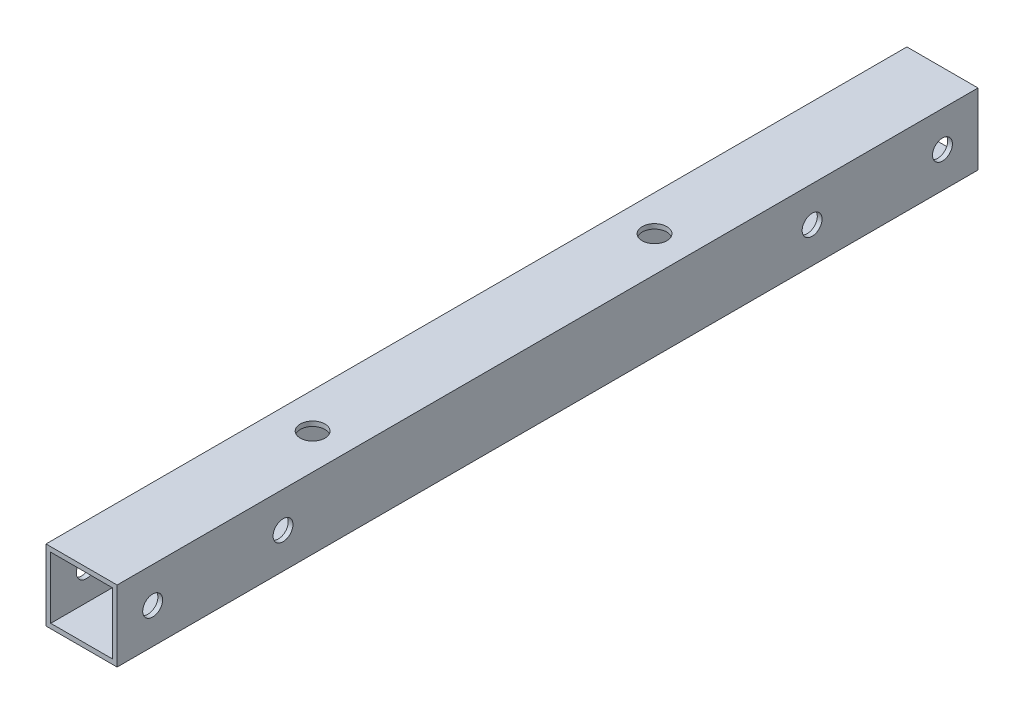
ISO-10303-21;
HEADER;
FILE_DESCRIPTION(('STEP AP214'),'2;1');
FILE_NAME('part.step','',(''),(''),'','','');
FILE_SCHEMA(('AUTOMOTIVE_DESIGN { 1 0 10303 214 1 1 1 1 }'));
ENDSEC;
DATA;
#1=APPLICATION_CONTEXT('core data for automotive mechanical design processes');
#2=APPLICATION_PROTOCOL_DEFINITION('international standard','automotive_design',2000,#1);
#3=PRODUCT_CONTEXT('',#1,'mechanical');
#4=PRODUCT('Part','Part','',(#3));
#5=PRODUCT_RELATED_PRODUCT_CATEGORY('part','',(#4));
#6=PRODUCT_DEFINITION_FORMATION('','',#4);
#7=PRODUCT_DEFINITION_CONTEXT('part definition',#1,'design');
#8=PRODUCT_DEFINITION('design','',#6,#7);
#9=PRODUCT_DEFINITION_SHAPE('','',#8);
#10=(LENGTH_UNIT() NAMED_UNIT(*) SI_UNIT(.MILLI.,.METRE.));
#11=(NAMED_UNIT(*) PLANE_ANGLE_UNIT() SI_UNIT($,.RADIAN.));
#12=(NAMED_UNIT(*) SI_UNIT($,.STERADIAN.) SOLID_ANGLE_UNIT());
#13=UNCERTAINTY_MEASURE_WITH_UNIT(LENGTH_MEASURE(1.E-05),#10,'distance_accuracy_value','');
#14=(GEOMETRIC_REPRESENTATION_CONTEXT(3) GLOBAL_UNCERTAINTY_ASSIGNED_CONTEXT((#13)) GLOBAL_UNIT_ASSIGNED_CONTEXT((#10,
#11,#12)) REPRESENTATION_CONTEXT('',''));
#15=CARTESIAN_POINT('',(0.,0.,0.));
#16=DIRECTION('',(0.,0.,1.));
#17=DIRECTION('',(1.,0.,0.));
#18=AXIS2_PLACEMENT_3D('',#15,#16,#17);
#19=CARTESIAN_POINT('',(0.,0.,181.6));
#20=DIRECTION('',(0.,0.,1.));
#21=DIRECTION('',(1.,0.,0.));
#22=AXIS2_PLACEMENT_3D('',#19,#20,#21);
#23=PLANE('',#22);
#24=DIRECTION('',(0.,-1.,0.));
#25=VECTOR('',#24,1.);
#26=CARTESIAN_POINT('',(-7.5,7.5,181.6));
#27=LINE('',#26,#25);
#28=CARTESIAN_POINT('',(-7.5,7.5,181.6));
#29=VERTEX_POINT('',#28);
#30=CARTESIAN_POINT('',(-7.5,-7.5,181.6));
#31=VERTEX_POINT('',#30);
#32=EDGE_CURVE('E162',#29,#31,#27,.T.);
#33=ORIENTED_EDGE('',*,*,#32,.T.);
#34=DIRECTION('',(1.,0.,0.));
#35=VECTOR('',#34,1.);
#36=CARTESIAN_POINT('',(7.5,-7.5,181.6));
#37=LINE('',#36,#35);
#38=CARTESIAN_POINT('',(7.5,-7.5,181.6));
#39=VERTEX_POINT('',#38);
#40=EDGE_CURVE('E165',#31,#39,#37,.T.);
#41=ORIENTED_EDGE('',*,*,#40,.T.);
#42=DIRECTION('',(0.,1.,0.));
#43=VECTOR('',#42,1.);
#44=CARTESIAN_POINT('',(7.5,7.5,181.6));
#45=LINE('',#44,#43);
#46=CARTESIAN_POINT('',(7.5,7.5,181.6));
#47=VERTEX_POINT('',#46);
#48=EDGE_CURVE('E168',#39,#47,#45,.T.);
#49=ORIENTED_EDGE('',*,*,#48,.T.);
#50=DIRECTION('',(-1.,0.,0.));
#51=VECTOR('',#50,1.);
#52=CARTESIAN_POINT('',(7.5,7.5,181.6));
#53=LINE('',#52,#51);
#54=EDGE_CURVE('E170',#47,#29,#53,.T.);
#55=ORIENTED_EDGE('',*,*,#54,.T.);
#56=EDGE_LOOP('',(#33,#41,#49,#55));
#57=FACE_BOUND('',#56,.T.);
#58=DIRECTION('',(1.,0.,0.));
#59=VECTOR('',#58,1.);
#60=CARTESIAN_POINT('',(0.,-6.5,181.6));
#61=LINE('',#60,#59);
#62=CARTESIAN_POINT('',(-6.5,-6.5,181.6));
#63=VERTEX_POINT('',#62);
#64=CARTESIAN_POINT('',(6.5,-6.5,181.6));
#65=VERTEX_POINT('',#64);
#66=EDGE_CURVE('E132',#63,#65,#61,.T.);
#67=ORIENTED_EDGE('',*,*,#66,.F.);
#68=DIRECTION('',(0.,-1.,0.));
#69=VECTOR('',#68,1.);
#70=CARTESIAN_POINT('',(-6.5,0.,181.6));
#71=LINE('',#70,#69);
#72=CARTESIAN_POINT('',(-6.5,6.5,181.6));
#73=VERTEX_POINT('',#72);
#74=EDGE_CURVE('E124',#73,#63,#71,.T.);
#75=ORIENTED_EDGE('',*,*,#74,.F.);
#76=DIRECTION('',(-1.,0.,0.));
#77=VECTOR('',#76,1.);
#78=CARTESIAN_POINT('',(0.,6.5,181.6));
#79=LINE('',#78,#77);
#80=CARTESIAN_POINT('',(6.5,6.5,181.6));
#81=VERTEX_POINT('',#80);
#82=EDGE_CURVE('E146',#81,#73,#79,.T.);
#83=ORIENTED_EDGE('',*,*,#82,.F.);
#84=DIRECTION('',(0.,1.,0.));
#85=VECTOR('',#84,1.);
#86=CARTESIAN_POINT('',(6.5,0.,181.6));
#87=LINE('',#86,#85);
#88=EDGE_CURVE('E144',#65,#81,#87,.T.);
#89=ORIENTED_EDGE('',*,*,#88,.F.);
#90=EDGE_LOOP('',(#67,#75,#83,#89));
#91=FACE_BOUND('',#90,.T.);
#92=ADVANCED_FACE('F57',(#57,#91),#23,.T.);
#93=CARTESIAN_POINT('',(0.,0.,0.));
#94=DIRECTION('',(0.,0.,1.));
#95=DIRECTION('',(1.,0.,0.));
#96=AXIS2_PLACEMENT_3D('',#93,#94,#95);
#97=PLANE('',#96);
#98=DIRECTION('',(0.,-1.,0.));
#99=VECTOR('',#98,1.);
#100=CARTESIAN_POINT('',(-7.5,7.5,0.));
#101=LINE('',#100,#99);
#102=CARTESIAN_POINT('',(-7.5,7.5,0.));
#103=VERTEX_POINT('',#102);
#104=CARTESIAN_POINT('',(-7.5,-7.5,0.));
#105=VERTEX_POINT('',#104);
#106=EDGE_CURVE('E140',#103,#105,#101,.T.);
#107=ORIENTED_EDGE('',*,*,#106,.F.);
#108=DIRECTION('',(-1.,0.,0.));
#109=VECTOR('',#108,1.);
#110=CARTESIAN_POINT('',(7.5,7.5,0.));
#111=LINE('',#110,#109);
#112=CARTESIAN_POINT('',(7.5,7.5,0.));
#113=VERTEX_POINT('',#112);
#114=EDGE_CURVE('E166',#113,#103,#111,.T.);
#115=ORIENTED_EDGE('',*,*,#114,.F.);
#116=DIRECTION('',(0.,1.,0.));
#117=VECTOR('',#116,1.);
#118=CARTESIAN_POINT('',(7.5,7.5,0.));
#119=LINE('',#118,#117);
#120=CARTESIAN_POINT('',(7.5,-7.5,0.));
#121=VERTEX_POINT('',#120);
#122=EDGE_CURVE('E177',#121,#113,#119,.T.);
#123=ORIENTED_EDGE('',*,*,#122,.F.);
#124=DIRECTION('',(1.,0.,0.));
#125=VECTOR('',#124,1.);
#126=CARTESIAN_POINT('',(7.5,-7.5,0.));
#127=LINE('',#126,#125);
#128=EDGE_CURVE('E175',#105,#121,#127,.T.);
#129=ORIENTED_EDGE('',*,*,#128,.F.);
#130=EDGE_LOOP('',(#107,#115,#123,#129));
#131=FACE_BOUND('',#130,.T.);
#132=DIRECTION('',(0.,-1.,0.));
#133=VECTOR('',#132,1.);
#134=CARTESIAN_POINT('',(-6.5,0.,0.));
#135=LINE('',#134,#133);
#136=CARTESIAN_POINT('',(-6.5,6.5,0.));
#137=VERTEX_POINT('',#136);
#138=CARTESIAN_POINT('',(-6.5,-6.5,0.));
#139=VERTEX_POINT('',#138);
#140=EDGE_CURVE('E82',#137,#139,#135,.T.);
#141=ORIENTED_EDGE('',*,*,#140,.T.);
#142=DIRECTION('',(1.,0.,0.));
#143=VECTOR('',#142,1.);
#144=CARTESIAN_POINT('',(0.,-6.5,0.));
#145=LINE('',#144,#143);
#146=CARTESIAN_POINT('',(6.5,-6.5,0.));
#147=VERTEX_POINT('',#146);
#148=EDGE_CURVE('E139',#139,#147,#145,.T.);
#149=ORIENTED_EDGE('',*,*,#148,.T.);
#150=DIRECTION('',(0.,1.,0.));
#151=VECTOR('',#150,1.);
#152=CARTESIAN_POINT('',(6.5,0.,0.));
#153=LINE('',#152,#151);
#154=CARTESIAN_POINT('',(6.5,6.5,0.));
#155=VERTEX_POINT('',#154);
#156=EDGE_CURVE('E154',#147,#155,#153,.T.);
#157=ORIENTED_EDGE('',*,*,#156,.T.);
#158=DIRECTION('',(-1.,0.,0.));
#159=VECTOR('',#158,1.);
#160=CARTESIAN_POINT('',(0.,6.5,0.));
#161=LINE('',#160,#159);
#162=EDGE_CURVE('E133',#155,#137,#161,.T.);
#163=ORIENTED_EDGE('',*,*,#162,.T.);
#164=EDGE_LOOP('',(#141,#149,#157,#163));
#165=FACE_BOUND('',#164,.T.);
#166=ADVANCED_FACE('F266',(#131,#165),#97,.F.);
#167=CARTESIAN_POINT('',(-7.5,7.5,181.6));
#168=DIRECTION('',(1.,0.,0.));
#169=DIRECTION('',(0.,1.,0.));
#170=AXIS2_PLACEMENT_3D('',#167,#168,#169);
#171=PLANE('',#170);
#172=CARTESIAN_POINT('',(-7.5,0.,174.1));
#173=DIRECTION('',(-1.,0.,0.));
#174=DIRECTION('',(0.,-1.,0.));
#175=AXIS2_PLACEMENT_3D('',#172,#173,#174);
#176=CIRCLE('',#175,2.09999999999999);
#177=CARTESIAN_POINT('',(-7.5,-2.09999999999999,174.1));
#178=VERTEX_POINT('',#177);
#179=EDGE_CURVE('E317',#178,#178,#176,.T.);
#180=ORIENTED_EDGE('',*,*,#179,.F.);
#181=EDGE_LOOP('',(#180));
#182=FACE_BOUND('',#181,.T.);
#183=CARTESIAN_POINT('',(-7.5,0.,146.6));
#184=DIRECTION('',(-1.,0.,0.));
#185=DIRECTION('',(0.,-1.,0.));
#186=AXIS2_PLACEMENT_3D('',#183,#184,#185);
#187=CIRCLE('',#186,2.09999999999999);
#188=CARTESIAN_POINT('',(-7.5,-2.09999999999999,146.6));
#189=VERTEX_POINT('',#188);
#190=EDGE_CURVE('E313',#189,#189,#187,.T.);
#191=ORIENTED_EDGE('',*,*,#190,.F.);
#192=EDGE_LOOP('',(#191));
#193=FACE_BOUND('',#192,.T.);
#194=CARTESIAN_POINT('',(-7.5,0.,35.));
#195=DIRECTION('',(-1.,0.,0.));
#196=DIRECTION('',(0.,1.,0.));
#197=AXIS2_PLACEMENT_3D('',#194,#195,#196);
#198=CIRCLE('',#197,2.09999999999999);
#199=CARTESIAN_POINT('',(-7.5,2.09999999999999,35.));
#200=VERTEX_POINT('',#199);
#201=EDGE_CURVE('E305',#200,#200,#198,.T.);
#202=ORIENTED_EDGE('',*,*,#201,.F.);
#203=EDGE_LOOP('',(#202));
#204=FACE_BOUND('',#203,.T.);
#205=CARTESIAN_POINT('',(-7.5,0.,7.50000000000001));
#206=DIRECTION('',(-1.,0.,0.));
#207=DIRECTION('',(0.,1.,0.));
#208=AXIS2_PLACEMENT_3D('',#205,#206,#207);
#209=CIRCLE('',#208,2.09999999999999);
#210=CARTESIAN_POINT('',(-7.5,2.09999999999999,7.50000000000001));
#211=VERTEX_POINT('',#210);
#212=EDGE_CURVE('E306',#211,#211,#209,.T.);
#213=ORIENTED_EDGE('',*,*,#212,.F.);
#214=EDGE_LOOP('',(#213));
#215=FACE_BOUND('',#214,.T.);
#216=ORIENTED_EDGE('',*,*,#106,.T.);
#217=DIRECTION('',(0.,0.,-1.));
#218=VECTOR('',#217,1.);
#219=CARTESIAN_POINT('',(-7.5,-7.5,181.6));
#220=LINE('',#219,#218);
#221=EDGE_CURVE('E12',#31,#105,#220,.T.);
#222=ORIENTED_EDGE('',*,*,#221,.F.);
#223=ORIENTED_EDGE('',*,*,#32,.F.);
#224=DIRECTION('',(0.,0.,-1.));
#225=VECTOR('',#224,1.);
#226=CARTESIAN_POINT('',(-7.5,7.5,181.6));
#227=LINE('',#226,#225);
#228=EDGE_CURVE('E172',#29,#103,#227,.T.);
#229=ORIENTED_EDGE('',*,*,#228,.T.);
#230=EDGE_LOOP('',(#216,#222,#223,#229));
#231=FACE_BOUND('',#230,.T.);
#232=ADVANCED_FACE('F59',(#182,#193,#204,#215,#231),#171,.F.);
#233=CARTESIAN_POINT('',(7.5,-7.5,181.6));
#234=DIRECTION('',(0.,1.,0.));
#235=DIRECTION('',(-1.,0.,0.));
#236=AXIS2_PLACEMENT_3D('',#233,#234,#235);
#237=PLANE('',#236);
#238=CARTESIAN_POINT('',(0.,-7.5,132.86));
#239=DIRECTION('',(0.,1.,0.));
#240=DIRECTION('',(-1.,0.,0.));
#241=AXIS2_PLACEMENT_3D('',#238,#239,#240);
#242=CIRCLE('',#241,2.59999999999999);
#243=CARTESIAN_POINT('',(-2.59999999999997,-7.5,132.86));
#244=VERTEX_POINT('',#243);
#245=EDGE_CURVE('E191',#244,#244,#242,.T.);
#246=ORIENTED_EDGE('',*,*,#245,.T.);
#247=EDGE_LOOP('',(#246));
#248=FACE_BOUND('',#247,.T.);
#249=CARTESIAN_POINT('',(0.,-7.5,60.7399999999999));
#250=DIRECTION('',(0.,1.,0.));
#251=DIRECTION('',(1.,0.,0.));
#252=AXIS2_PLACEMENT_3D('',#249,#250,#251);
#253=CIRCLE('',#252,2.6);
#254=CARTESIAN_POINT('',(-2.59999999999999,-7.5,60.7399999999999));
#255=VERTEX_POINT('',#254);
#256=EDGE_CURVE('E226',#255,#255,#253,.T.);
#257=ORIENTED_EDGE('',*,*,#256,.T.);
#258=EDGE_LOOP('',(#257));
#259=FACE_BOUND('',#258,.T.);
#260=ORIENTED_EDGE('',*,*,#128,.T.);
#261=DIRECTION('',(0.,0.,-1.));
#262=VECTOR('',#261,1.);
#263=CARTESIAN_POINT('',(7.5,-7.5,181.6));
#264=LINE('',#263,#262);
#265=EDGE_CURVE('E66',#39,#121,#264,.T.);
#266=ORIENTED_EDGE('',*,*,#265,.F.);
#267=ORIENTED_EDGE('',*,*,#40,.F.);
#268=ORIENTED_EDGE('',*,*,#221,.T.);
#269=EDGE_LOOP('',(#260,#266,#267,#268));
#270=FACE_BOUND('',#269,.T.);
#271=ADVANCED_FACE('F252',(#248,#259,#270),#237,.F.);
#272=CARTESIAN_POINT('',(7.5,7.5,181.6));
#273=DIRECTION('',(-1.,0.,0.));
#274=DIRECTION('',(0.,-1.,0.));
#275=AXIS2_PLACEMENT_3D('',#272,#273,#274);
#276=PLANE('',#275);
#277=CARTESIAN_POINT('',(7.5,0.,174.1));
#278=DIRECTION('',(-1.,0.,0.));
#279=DIRECTION('',(0.,-1.,0.));
#280=AXIS2_PLACEMENT_3D('',#277,#278,#279);
#281=CIRCLE('',#280,2.09999999999999);
#282=CARTESIAN_POINT('',(7.5,-2.09999999999999,174.1));
#283=VERTEX_POINT('',#282);
#284=EDGE_CURVE('E199',#283,#283,#281,.T.);
#285=ORIENTED_EDGE('',*,*,#284,.T.);
#286=EDGE_LOOP('',(#285));
#287=FACE_BOUND('',#286,.T.);
#288=CARTESIAN_POINT('',(7.5,0.,146.6));
#289=DIRECTION('',(-1.,0.,0.));
#290=DIRECTION('',(0.,-1.,0.));
#291=AXIS2_PLACEMENT_3D('',#288,#289,#290);
#292=CIRCLE('',#291,2.09999999999999);
#293=CARTESIAN_POINT('',(7.5,-2.09999999999999,146.6));
#294=VERTEX_POINT('',#293);
#295=EDGE_CURVE('E296',#294,#294,#292,.T.);
#296=ORIENTED_EDGE('',*,*,#295,.T.);
#297=EDGE_LOOP('',(#296));
#298=FACE_BOUND('',#297,.T.);
#299=CARTESIAN_POINT('',(7.5,0.,35.));
#300=DIRECTION('',(-1.,0.,0.));
#301=DIRECTION('',(0.,1.,0.));
#302=AXIS2_PLACEMENT_3D('',#299,#300,#301);
#303=CIRCLE('',#302,2.09999999999999);
#304=CARTESIAN_POINT('',(7.5,2.09999999999999,35.));
#305=VERTEX_POINT('',#304);
#306=EDGE_CURVE('E300',#305,#305,#303,.T.);
#307=ORIENTED_EDGE('',*,*,#306,.T.);
#308=EDGE_LOOP('',(#307));
#309=FACE_BOUND('',#308,.T.);
#310=CARTESIAN_POINT('',(7.5,0.,7.50000000000001));
#311=DIRECTION('',(-1.,0.,0.));
#312=DIRECTION('',(0.,1.,0.));
#313=AXIS2_PLACEMENT_3D('',#310,#311,#312);
#314=CIRCLE('',#313,2.09999999999999);
#315=CARTESIAN_POINT('',(7.5,2.09999999999999,7.50000000000001));
#316=VERTEX_POINT('',#315);
#317=EDGE_CURVE('E303',#316,#316,#314,.T.);
#318=ORIENTED_EDGE('',*,*,#317,.T.);
#319=EDGE_LOOP('',(#318));
#320=FACE_BOUND('',#319,.T.);
#321=ORIENTED_EDGE('',*,*,#122,.T.);
#322=DIRECTION('',(0.,0.,-1.));
#323=VECTOR('',#322,1.);
#324=CARTESIAN_POINT('',(7.5,7.5,181.6));
#325=LINE('',#324,#323);
#326=EDGE_CURVE('E182',#47,#113,#325,.T.);
#327=ORIENTED_EDGE('',*,*,#326,.F.);
#328=ORIENTED_EDGE('',*,*,#48,.F.);
#329=ORIENTED_EDGE('',*,*,#265,.T.);
#330=EDGE_LOOP('',(#321,#327,#328,#329));
#331=FACE_BOUND('',#330,.T.);
#332=ADVANCED_FACE('F255',(#287,#298,#309,#320,#331),#276,.F.);
#333=CARTESIAN_POINT('',(7.5,7.5,181.6));
#334=DIRECTION('',(0.,-1.,0.));
#335=DIRECTION('',(1.,0.,0.));
#336=AXIS2_PLACEMENT_3D('',#333,#334,#335);
#337=PLANE('',#336);
#338=CARTESIAN_POINT('',(0.,7.5,132.86));
#339=DIRECTION('',(0.,1.,0.));
#340=DIRECTION('',(-1.,0.,0.));
#341=AXIS2_PLACEMENT_3D('',#338,#339,#340);
#342=CIRCLE('',#341,2.59999999999999);
#343=CARTESIAN_POINT('',(-2.59999999999998,7.5,132.86));
#344=VERTEX_POINT('',#343);
#345=EDGE_CURVE('E223',#344,#344,#342,.T.);
#346=ORIENTED_EDGE('',*,*,#345,.F.);
#347=EDGE_LOOP('',(#346));
#348=FACE_BOUND('',#347,.T.);
#349=CARTESIAN_POINT('',(0.,7.5,60.7399999999999));
#350=DIRECTION('',(0.,1.,0.));
#351=DIRECTION('',(1.,0.,0.));
#352=AXIS2_PLACEMENT_3D('',#349,#350,#351);
#353=CIRCLE('',#352,2.6);
#354=CARTESIAN_POINT('',(-2.59999999999999,7.5,60.7399999999999));
#355=VERTEX_POINT('',#354);
#356=EDGE_CURVE('E220',#355,#355,#353,.T.);
#357=ORIENTED_EDGE('',*,*,#356,.F.);
#358=EDGE_LOOP('',(#357));
#359=FACE_BOUND('',#358,.T.);
#360=ORIENTED_EDGE('',*,*,#114,.T.);
#361=ORIENTED_EDGE('',*,*,#228,.F.);
#362=ORIENTED_EDGE('',*,*,#54,.F.);
#363=ORIENTED_EDGE('',*,*,#326,.T.);
#364=EDGE_LOOP('',(#360,#361,#362,#363));
#365=FACE_BOUND('',#364,.T.);
#366=ADVANCED_FACE('F270',(#348,#359,#365),#337,.F.);
#367=CARTESIAN_POINT('',(-6.5,0.,181.6));
#368=DIRECTION('',(1.,0.,0.));
#369=DIRECTION('',(0.,1.,0.));
#370=AXIS2_PLACEMENT_3D('',#367,#368,#369);
#371=PLANE('',#370);
#372=CARTESIAN_POINT('',(-6.5,0.,174.1));
#373=DIRECTION('',(1.,0.,0.));
#374=DIRECTION('',(0.,1.,0.));
#375=AXIS2_PLACEMENT_3D('',#372,#373,#374);
#376=CIRCLE('',#375,2.09999999999999);
#377=CARTESIAN_POINT('',(-6.5,2.09999999999999,174.1));
#378=VERTEX_POINT('',#377);
#379=EDGE_CURVE('E217',#378,#378,#376,.T.);
#380=ORIENTED_EDGE('',*,*,#379,.F.);
#381=EDGE_LOOP('',(#380));
#382=FACE_BOUND('',#381,.T.);
#383=CARTESIAN_POINT('',(-6.5,0.,146.6));
#384=DIRECTION('',(1.,0.,0.));
#385=DIRECTION('',(0.,1.,0.));
#386=AXIS2_PLACEMENT_3D('',#383,#384,#385);
#387=CIRCLE('',#386,2.09999999999999);
#388=CARTESIAN_POINT('',(-6.5,2.09999999999999,146.6));
#389=VERTEX_POINT('',#388);
#390=EDGE_CURVE('E205',#389,#389,#387,.T.);
#391=ORIENTED_EDGE('',*,*,#390,.F.);
#392=EDGE_LOOP('',(#391));
#393=FACE_BOUND('',#392,.T.);
#394=CARTESIAN_POINT('',(-6.5,0.,35.));
#395=DIRECTION('',(1.,0.,0.));
#396=DIRECTION('',(0.,1.,0.));
#397=AXIS2_PLACEMENT_3D('',#394,#395,#396);
#398=CIRCLE('',#397,2.09999999999999);
#399=CARTESIAN_POINT('',(-6.5,2.09999999999999,35.));
#400=VERTEX_POINT('',#399);
#401=EDGE_CURVE('E202',#400,#400,#398,.T.);
#402=ORIENTED_EDGE('',*,*,#401,.F.);
#403=EDGE_LOOP('',(#402));
#404=FACE_BOUND('',#403,.T.);
#405=CARTESIAN_POINT('',(-6.5,0.,7.50000000000001));
#406=DIRECTION('',(1.,0.,0.));
#407=DIRECTION('',(0.,1.,0.));
#408=AXIS2_PLACEMENT_3D('',#405,#406,#407);
#409=CIRCLE('',#408,2.09999999999999);
#410=CARTESIAN_POINT('',(-6.5,2.09999999999999,7.50000000000001));
#411=VERTEX_POINT('',#410);
#412=EDGE_CURVE('E198',#411,#411,#409,.T.);
#413=ORIENTED_EDGE('',*,*,#412,.F.);
#414=EDGE_LOOP('',(#413));
#415=FACE_BOUND('',#414,.T.);
#416=ORIENTED_EDGE('',*,*,#140,.F.);
#417=DIRECTION('',(0.,0.,-1.));
#418=VECTOR('',#417,1.);
#419=CARTESIAN_POINT('',(-6.5,6.5,181.6));
#420=LINE('',#419,#418);
#421=EDGE_CURVE('E128',#73,#137,#420,.T.);
#422=ORIENTED_EDGE('',*,*,#421,.F.);
#423=ORIENTED_EDGE('',*,*,#74,.T.);
#424=DIRECTION('',(0.,0.,-1.));
#425=VECTOR('',#424,1.);
#426=CARTESIAN_POINT('',(-6.5,-6.5,181.6));
#427=LINE('',#426,#425);
#428=EDGE_CURVE('E127',#63,#139,#427,.T.);
#429=ORIENTED_EDGE('',*,*,#428,.T.);
#430=EDGE_LOOP('',(#416,#422,#423,#429));
#431=FACE_BOUND('',#430,.T.);
#432=ADVANCED_FACE('F126',(#382,#393,#404,#415,#431),#371,.T.);
#433=CARTESIAN_POINT('',(0.,-6.5,181.6));
#434=DIRECTION('',(0.,1.,0.));
#435=DIRECTION('',(-1.,0.,0.));
#436=AXIS2_PLACEMENT_3D('',#433,#434,#435);
#437=PLANE('',#436);
#438=CARTESIAN_POINT('',(0.,-6.5,132.86));
#439=DIRECTION('',(0.,1.,0.));
#440=DIRECTION('',(-1.,0.,0.));
#441=AXIS2_PLACEMENT_3D('',#438,#439,#440);
#442=CIRCLE('',#441,2.59999999999999);
#443=CARTESIAN_POINT('',(-2.59999999999997,-6.5,132.86));
#444=VERTEX_POINT('',#443);
#445=EDGE_CURVE('E152',#444,#444,#442,.T.);
#446=ORIENTED_EDGE('',*,*,#445,.F.);
#447=EDGE_LOOP('',(#446));
#448=FACE_BOUND('',#447,.T.);
#449=CARTESIAN_POINT('',(0.,-6.5,60.7399999999999));
#450=DIRECTION('',(0.,1.,0.));
#451=DIRECTION('',(-1.,0.,0.));
#452=AXIS2_PLACEMENT_3D('',#449,#450,#451);
#453=CIRCLE('',#452,2.6);
#454=CARTESIAN_POINT('',(-2.59999999999999,-6.5,60.7399999999999));
#455=VERTEX_POINT('',#454);
#456=EDGE_CURVE('E190',#455,#455,#453,.T.);
#457=ORIENTED_EDGE('',*,*,#456,.F.);
#458=EDGE_LOOP('',(#457));
#459=FACE_BOUND('',#458,.T.);
#460=ORIENTED_EDGE('',*,*,#148,.F.);
#461=ORIENTED_EDGE('',*,*,#428,.F.);
#462=ORIENTED_EDGE('',*,*,#66,.T.);
#463=DIRECTION('',(0.,0.,-1.));
#464=VECTOR('',#463,1.);
#465=CARTESIAN_POINT('',(6.5,-6.5,181.6));
#466=LINE('',#465,#464);
#467=EDGE_CURVE('E141',#65,#147,#466,.T.);
#468=ORIENTED_EDGE('',*,*,#467,.T.);
#469=EDGE_LOOP('',(#460,#461,#462,#468));
#470=FACE_BOUND('',#469,.T.);
#471=ADVANCED_FACE('F136',(#448,#459,#470),#437,.T.);
#472=CARTESIAN_POINT('',(6.5,0.,181.6));
#473=DIRECTION('',(-1.,0.,0.));
#474=DIRECTION('',(0.,-1.,0.));
#475=AXIS2_PLACEMENT_3D('',#472,#473,#474);
#476=PLANE('',#475);
#477=CARTESIAN_POINT('',(6.5,0.,174.1));
#478=DIRECTION('',(-1.,0.,0.));
#479=DIRECTION('',(0.,-1.,0.));
#480=AXIS2_PLACEMENT_3D('',#477,#478,#479);
#481=CIRCLE('',#480,2.09999999999999);
#482=CARTESIAN_POINT('',(6.5,-2.09999999999999,174.1));
#483=VERTEX_POINT('',#482);
#484=EDGE_CURVE('E61',#483,#483,#481,.T.);
#485=ORIENTED_EDGE('',*,*,#484,.F.);
#486=EDGE_LOOP('',(#485));
#487=FACE_BOUND('',#486,.T.);
#488=CARTESIAN_POINT('',(6.5,0.,146.6));
#489=DIRECTION('',(-1.,0.,0.));
#490=DIRECTION('',(0.,-1.,0.));
#491=AXIS2_PLACEMENT_3D('',#488,#489,#490);
#492=CIRCLE('',#491,2.09999999999999);
#493=CARTESIAN_POINT('',(6.5,-2.09999999999999,146.6));
#494=VERTEX_POINT('',#493);
#495=EDGE_CURVE('E203',#494,#494,#492,.T.);
#496=ORIENTED_EDGE('',*,*,#495,.F.);
#497=EDGE_LOOP('',(#496));
#498=FACE_BOUND('',#497,.T.);
#499=CARTESIAN_POINT('',(6.5,0.,35.));
#500=DIRECTION('',(-1.,0.,0.));
#501=DIRECTION('',(0.,-1.,0.));
#502=AXIS2_PLACEMENT_3D('',#499,#500,#501);
#503=CIRCLE('',#502,2.09999999999999);
#504=CARTESIAN_POINT('',(6.5,-2.09999999999999,35.));
#505=VERTEX_POINT('',#504);
#506=EDGE_CURVE('E200',#505,#505,#503,.T.);
#507=ORIENTED_EDGE('',*,*,#506,.F.);
#508=EDGE_LOOP('',(#507));
#509=FACE_BOUND('',#508,.T.);
#510=CARTESIAN_POINT('',(6.5,0.,7.50000000000001));
#511=DIRECTION('',(-1.,0.,0.));
#512=DIRECTION('',(0.,-1.,0.));
#513=AXIS2_PLACEMENT_3D('',#510,#511,#512);
#514=CIRCLE('',#513,2.09999999999999);
#515=CARTESIAN_POINT('',(6.5,-2.09999999999999,7.50000000000001));
#516=VERTEX_POINT('',#515);
#517=EDGE_CURVE('E195',#516,#516,#514,.T.);
#518=ORIENTED_EDGE('',*,*,#517,.F.);
#519=EDGE_LOOP('',(#518));
#520=FACE_BOUND('',#519,.T.);
#521=ORIENTED_EDGE('',*,*,#156,.F.);
#522=ORIENTED_EDGE('',*,*,#467,.F.);
#523=ORIENTED_EDGE('',*,*,#88,.T.);
#524=DIRECTION('',(0.,0.,-1.));
#525=VECTOR('',#524,1.);
#526=CARTESIAN_POINT('',(6.5,6.5,181.6));
#527=LINE('',#526,#525);
#528=EDGE_CURVE('E74',#81,#155,#527,.T.);
#529=ORIENTED_EDGE('',*,*,#528,.T.);
#530=EDGE_LOOP('',(#521,#522,#523,#529));
#531=FACE_BOUND('',#530,.T.);
#532=ADVANCED_FACE('F240',(#487,#498,#509,#520,#531),#476,.T.);
#533=CARTESIAN_POINT('',(0.,6.5,181.6));
#534=DIRECTION('',(0.,-1.,0.));
#535=DIRECTION('',(1.,0.,0.));
#536=AXIS2_PLACEMENT_3D('',#533,#534,#535);
#537=PLANE('',#536);
#538=CARTESIAN_POINT('',(0.,6.5,132.86));
#539=DIRECTION('',(0.,-1.,0.));
#540=DIRECTION('',(1.,0.,0.));
#541=AXIS2_PLACEMENT_3D('',#538,#539,#540);
#542=CIRCLE('',#541,2.59999999999999);
#543=CARTESIAN_POINT('',(-2.59999999999998,6.5,132.86));
#544=VERTEX_POINT('',#543);
#545=EDGE_CURVE('E192',#544,#544,#542,.T.);
#546=ORIENTED_EDGE('',*,*,#545,.F.);
#547=EDGE_LOOP('',(#546));
#548=FACE_BOUND('',#547,.T.);
#549=CARTESIAN_POINT('',(0.,6.5,60.7399999999999));
#550=DIRECTION('',(0.,-1.,0.));
#551=DIRECTION('',(1.,0.,0.));
#552=AXIS2_PLACEMENT_3D('',#549,#550,#551);
#553=CIRCLE('',#552,2.6);
#554=CARTESIAN_POINT('',(-2.59999999999999,6.5,60.7399999999999));
#555=VERTEX_POINT('',#554);
#556=EDGE_CURVE('E187',#555,#555,#553,.T.);
#557=ORIENTED_EDGE('',*,*,#556,.F.);
#558=EDGE_LOOP('',(#557));
#559=FACE_BOUND('',#558,.T.);
#560=ORIENTED_EDGE('',*,*,#162,.F.);
#561=ORIENTED_EDGE('',*,*,#528,.F.);
#562=ORIENTED_EDGE('',*,*,#82,.T.);
#563=ORIENTED_EDGE('',*,*,#421,.T.);
#564=EDGE_LOOP('',(#560,#561,#562,#563));
#565=FACE_BOUND('',#564,.T.);
#566=ADVANCED_FACE('F362',(#548,#559,#565),#537,.T.);
#567=CARTESIAN_POINT('',(0.,-7.5,60.7399999999999));
#568=DIRECTION('',(0.,1.,0.));
#569=DIRECTION('',(-1.,0.,0.));
#570=AXIS2_PLACEMENT_3D('',#567,#568,#569);
#571=CYLINDRICAL_SURFACE('',#570,2.6);
#572=CARTESIAN_POINT('',(-2.59999999999999,6.5,60.7399999999999));
#573=CARTESIAN_POINT('',(-2.59999999999999,6.51041666666667,60.7399999999999));
#574=CARTESIAN_POINT('',(-2.59999999999999,6.52083333333333,60.7399999999999));
#575=CARTESIAN_POINT('',(-2.59999999999999,6.54166666666667,60.7399999999999));
#576=CARTESIAN_POINT('',(-2.59999999999999,6.55208333333333,60.7399999999999));
#577=CARTESIAN_POINT('',(-2.59999999999999,6.57291666666667,60.7399999999999));
#578=CARTESIAN_POINT('',(-2.59999999999999,6.58333333333333,60.7399999999999));
#579=CARTESIAN_POINT('',(-2.59999999999999,6.60416666666667,60.7399999999999));
#580=CARTESIAN_POINT('',(-2.59999999999999,6.61458333333333,60.7399999999999));
#581=CARTESIAN_POINT('',(-2.59999999999999,6.63541666666667,60.7399999999999));
#582=CARTESIAN_POINT('',(-2.59999999999999,6.64583333333333,60.7399999999999));
#583=CARTESIAN_POINT('',(-2.59999999999999,6.66666666666667,60.7399999999999));
#584=CARTESIAN_POINT('',(-2.59999999999999,6.67708333333333,60.7399999999999));
#585=CARTESIAN_POINT('',(-2.59999999999999,6.69791666666667,60.7399999999999));
#586=CARTESIAN_POINT('',(-2.59999999999999,6.70833333333333,60.7399999999999));
#587=CARTESIAN_POINT('',(-2.59999999999999,6.72916666666667,60.7399999999999));
#588=CARTESIAN_POINT('',(-2.59999999999999,6.73958333333334,60.7399999999999));
#589=CARTESIAN_POINT('',(-2.59999999999999,6.76041666666667,60.7399999999999));
#590=CARTESIAN_POINT('',(-2.59999999999999,6.77083333333333,60.7399999999999));
#591=CARTESIAN_POINT('',(-2.59999999999999,6.79166666666667,60.7399999999999));
#592=CARTESIAN_POINT('',(-2.59999999999999,6.80208333333333,60.7399999999999));
#593=CARTESIAN_POINT('',(-2.59999999999999,6.82291666666667,60.7399999999999));
#594=CARTESIAN_POINT('',(-2.59999999999999,6.83333333333333,60.7399999999999));
#595=CARTESIAN_POINT('',(-2.59999999999999,6.85416666666667,60.7399999999999));
#596=CARTESIAN_POINT('',(-2.59999999999999,6.86458333333333,60.7399999999999));
#597=CARTESIAN_POINT('',(-2.59999999999999,6.88541666666667,60.7399999999999));
#598=CARTESIAN_POINT('',(-2.59999999999999,6.89583333333333,60.7399999999999));
#599=CARTESIAN_POINT('',(-2.59999999999999,6.91666666666667,60.7399999999999));
#600=CARTESIAN_POINT('',(-2.59999999999999,6.92708333333333,60.7399999999999));
#601=CARTESIAN_POINT('',(-2.59999999999999,6.94791666666667,60.7399999999999));
#602=CARTESIAN_POINT('',(-2.59999999999999,6.95833333333333,60.7399999999999));
#603=CARTESIAN_POINT('',(-2.59999999999999,6.97916666666667,60.7399999999999));
#604=CARTESIAN_POINT('',(-2.59999999999999,6.98958333333333,60.7399999999999));
#605=CARTESIAN_POINT('',(-2.59999999999999,7.01041666666667,60.7399999999999));
#606=CARTESIAN_POINT('',(-2.59999999999999,7.02083333333333,60.7399999999999));
#607=CARTESIAN_POINT('',(-2.59999999999999,7.04166666666667,60.7399999999999));
#608=CARTESIAN_POINT('',(-2.59999999999999,7.05208333333333,60.7399999999999));
#609=CARTESIAN_POINT('',(-2.59999999999999,7.07291666666667,60.7399999999999));
#610=CARTESIAN_POINT('',(-2.59999999999999,7.08333333333333,60.7399999999999));
#611=CARTESIAN_POINT('',(-2.59999999999999,7.10416666666667,60.7399999999999));
#612=CARTESIAN_POINT('',(-2.59999999999999,7.11458333333333,60.7399999999999));
#613=CARTESIAN_POINT('',(-2.59999999999999,7.13541666666667,60.7399999999999));
#614=CARTESIAN_POINT('',(-2.59999999999999,7.14583333333333,60.7399999999999));
#615=CARTESIAN_POINT('',(-2.59999999999999,7.16666666666667,60.7399999999999));
#616=CARTESIAN_POINT('',(-2.59999999999999,7.17708333333333,60.7399999999999));
#617=CARTESIAN_POINT('',(-2.59999999999999,7.19791666666667,60.7399999999999));
#618=CARTESIAN_POINT('',(-2.59999999999999,7.20833333333333,60.7399999999999));
#619=CARTESIAN_POINT('',(-2.59999999999999,7.22916666666667,60.7399999999999));
#620=CARTESIAN_POINT('',(-2.59999999999999,7.23958333333333,60.7399999999999));
#621=CARTESIAN_POINT('',(-2.59999999999999,7.26041666666667,60.7399999999999));
#622=CARTESIAN_POINT('',(-2.59999999999999,7.27083333333333,60.7399999999999));
#623=CARTESIAN_POINT('',(-2.59999999999999,7.29166666666667,60.7399999999999));
#624=CARTESIAN_POINT('',(-2.59999999999999,7.30208333333333,60.7399999999999));
#625=CARTESIAN_POINT('',(-2.59999999999999,7.32291666666667,60.7399999999999));
#626=CARTESIAN_POINT('',(-2.59999999999999,7.33333333333333,60.7399999999999));
#627=CARTESIAN_POINT('',(-2.59999999999999,7.35416666666667,60.7399999999999));
#628=CARTESIAN_POINT('',(-2.59999999999999,7.36458333333333,60.7399999999999));
#629=CARTESIAN_POINT('',(-2.59999999999999,7.38541666666667,60.7399999999999));
#630=CARTESIAN_POINT('',(-2.59999999999999,7.39583333333333,60.7399999999999));
#631=CARTESIAN_POINT('',(-2.59999999999999,7.41666666666667,60.7399999999999));
#632=CARTESIAN_POINT('',(-2.59999999999999,7.42708333333333,60.7399999999999));
#633=CARTESIAN_POINT('',(-2.59999999999999,7.44791666666667,60.7399999999999));
#634=CARTESIAN_POINT('',(-2.59999999999999,7.45833333333333,60.7399999999999));
#635=CARTESIAN_POINT('',(-2.59999999999999,7.47916666666667,60.7399999999999));
#636=CARTESIAN_POINT('',(-2.59999999999999,7.48958333333333,60.7399999999999));
#637=CARTESIAN_POINT('',(-2.59999999999999,7.5,60.7399999999999));
#638=B_SPLINE_CURVE_WITH_KNOTS('',3,(#572,#573,#574,#575,#576,#577,#578,#579,#580,#581,#582,
#583,#584,#585,#586,#587,#588,#589,#590,#591,#592,#593,#594,#595,#596,#597,#598,#599,#600,#601,
#602,#603,#604,#605,#606,#607,#608,#609,#610,#611,#612,#613,#614,#615,#616,#617,#618,#619,#620,
#621,#622,#623,#624,#625,#626,#627,#628,#629,#630,#631,#632,#633,#634,#635,#636,#637),
.UNSPECIFIED.,.F.,.F.,(4,2,2,2,2,2,2,2,2,2,2,2,2,2,2,2,2,2,2,2,2,2,2,2,2,2,2,2,2,2,2,2,4),(0.,
0.03125,0.0625000000000001,0.0937500000000001,0.125,0.15625,0.1875,0.21875,0.25,
0.281249999999999,0.312499999999999,0.343749999999999,0.374999999999999,0.406249999999999,
0.437499999999999,0.468749999999999,0.499999999999999,0.531249999999999,0.562499999999999,
0.593749999999999,0.624999999999999,0.656249999999999,0.687499999999999,0.718749999999999,
0.749999999999997,0.781249999999997,0.812499999999997,0.843749999999997,0.874999999999997,
0.906249999999997,0.937499999999997,0.968749999999997,0.999999999999997),.UNSPECIFIED.);
#639=EDGE_CURVE('BSEAM249',#555,#355,#638,.T.);
#640=ORIENTED_EDGE('',*,*,#556,.T.);
#641=ORIENTED_EDGE('',*,*,#356,.T.);
#642=ORIENTED_EDGE('',*,*,#639,.T.);
#643=ORIENTED_EDGE('',*,*,#639,.F.);
#644=EDGE_LOOP('',(#640,#642,#641,#643));
#645=FACE_BOUND('',#644,.T.);
#646=ADVANCED_FACE('F249',(#645),#571,.F.);
#647=CARTESIAN_POINT('',(0.,-7.5,132.86));
#648=DIRECTION('',(0.,1.,0.));
#649=DIRECTION('',(-1.,0.,0.));
#650=AXIS2_PLACEMENT_3D('',#647,#648,#649);
#651=CYLINDRICAL_SURFACE('',#650,2.59999999999999);
#652=CARTESIAN_POINT('',(-2.59999999999998,6.5,132.86));
#653=CARTESIAN_POINT('',(-2.59999999999998,6.51041666666667,132.86));
#654=CARTESIAN_POINT('',(-2.59999999999998,6.52083333333333,132.86));
#655=CARTESIAN_POINT('',(-2.59999999999998,6.54166666666667,132.86));
#656=CARTESIAN_POINT('',(-2.59999999999998,6.55208333333333,132.86));
#657=CARTESIAN_POINT('',(-2.59999999999998,6.57291666666667,132.86));
#658=CARTESIAN_POINT('',(-2.59999999999998,6.58333333333333,132.86));
#659=CARTESIAN_POINT('',(-2.59999999999998,6.60416666666667,132.86));
#660=CARTESIAN_POINT('',(-2.59999999999998,6.61458333333333,132.86));
#661=CARTESIAN_POINT('',(-2.59999999999998,6.63541666666667,132.86));
#662=CARTESIAN_POINT('',(-2.59999999999998,6.64583333333333,132.86));
#663=CARTESIAN_POINT('',(-2.59999999999998,6.66666666666667,132.86));
#664=CARTESIAN_POINT('',(-2.59999999999998,6.67708333333333,132.86));
#665=CARTESIAN_POINT('',(-2.59999999999998,6.69791666666667,132.86));
#666=CARTESIAN_POINT('',(-2.59999999999998,6.70833333333333,132.86));
#667=CARTESIAN_POINT('',(-2.59999999999998,6.72916666666667,132.86));
#668=CARTESIAN_POINT('',(-2.59999999999998,6.73958333333334,132.86));
#669=CARTESIAN_POINT('',(-2.59999999999998,6.76041666666667,132.86));
#670=CARTESIAN_POINT('',(-2.59999999999998,6.77083333333333,132.86));
#671=CARTESIAN_POINT('',(-2.59999999999998,6.79166666666667,132.86));
#672=CARTESIAN_POINT('',(-2.59999999999998,6.80208333333333,132.86));
#673=CARTESIAN_POINT('',(-2.59999999999998,6.82291666666667,132.86));
#674=CARTESIAN_POINT('',(-2.59999999999998,6.83333333333333,132.86));
#675=CARTESIAN_POINT('',(-2.59999999999998,6.85416666666667,132.86));
#676=CARTESIAN_POINT('',(-2.59999999999998,6.86458333333333,132.86));
#677=CARTESIAN_POINT('',(-2.59999999999998,6.88541666666667,132.86));
#678=CARTESIAN_POINT('',(-2.59999999999998,6.89583333333333,132.86));
#679=CARTESIAN_POINT('',(-2.59999999999998,6.91666666666667,132.86));
#680=CARTESIAN_POINT('',(-2.59999999999998,6.92708333333333,132.86));
#681=CARTESIAN_POINT('',(-2.59999999999998,6.94791666666667,132.86));
#682=CARTESIAN_POINT('',(-2.59999999999998,6.95833333333333,132.86));
#683=CARTESIAN_POINT('',(-2.59999999999998,6.97916666666667,132.86));
#684=CARTESIAN_POINT('',(-2.59999999999998,6.98958333333333,132.86));
#685=CARTESIAN_POINT('',(-2.59999999999998,7.01041666666667,132.86));
#686=CARTESIAN_POINT('',(-2.59999999999998,7.02083333333333,132.86));
#687=CARTESIAN_POINT('',(-2.59999999999998,7.04166666666667,132.86));
#688=CARTESIAN_POINT('',(-2.59999999999998,7.05208333333333,132.86));
#689=CARTESIAN_POINT('',(-2.59999999999998,7.07291666666667,132.86));
#690=CARTESIAN_POINT('',(-2.59999999999998,7.08333333333333,132.86));
#691=CARTESIAN_POINT('',(-2.59999999999998,7.10416666666667,132.86));
#692=CARTESIAN_POINT('',(-2.59999999999998,7.11458333333333,132.86));
#693=CARTESIAN_POINT('',(-2.59999999999998,7.13541666666667,132.86));
#694=CARTESIAN_POINT('',(-2.59999999999998,7.14583333333333,132.86));
#695=CARTESIAN_POINT('',(-2.59999999999998,7.16666666666667,132.86));
#696=CARTESIAN_POINT('',(-2.59999999999998,7.17708333333333,132.86));
#697=CARTESIAN_POINT('',(-2.59999999999998,7.19791666666667,132.86));
#698=CARTESIAN_POINT('',(-2.59999999999998,7.20833333333333,132.86));
#699=CARTESIAN_POINT('',(-2.59999999999998,7.22916666666667,132.86));
#700=CARTESIAN_POINT('',(-2.59999999999998,7.23958333333333,132.86));
#701=CARTESIAN_POINT('',(-2.59999999999998,7.26041666666667,132.86));
#702=CARTESIAN_POINT('',(-2.59999999999998,7.27083333333333,132.86));
#703=CARTESIAN_POINT('',(-2.59999999999998,7.29166666666667,132.86));
#704=CARTESIAN_POINT('',(-2.59999999999998,7.30208333333333,132.86));
#705=CARTESIAN_POINT('',(-2.59999999999998,7.32291666666667,132.86));
#706=CARTESIAN_POINT('',(-2.59999999999998,7.33333333333333,132.86));
#707=CARTESIAN_POINT('',(-2.59999999999998,7.35416666666667,132.86));
#708=CARTESIAN_POINT('',(-2.59999999999998,7.36458333333333,132.86));
#709=CARTESIAN_POINT('',(-2.59999999999998,7.38541666666667,132.86));
#710=CARTESIAN_POINT('',(-2.59999999999998,7.39583333333333,132.86));
#711=CARTESIAN_POINT('',(-2.59999999999998,7.41666666666667,132.86));
#712=CARTESIAN_POINT('',(-2.59999999999998,7.42708333333333,132.86));
#713=CARTESIAN_POINT('',(-2.59999999999998,7.44791666666667,132.86));
#714=CARTESIAN_POINT('',(-2.59999999999998,7.45833333333333,132.86));
#715=CARTESIAN_POINT('',(-2.59999999999998,7.47916666666667,132.86));
#716=CARTESIAN_POINT('',(-2.59999999999998,7.48958333333333,132.86));
#717=CARTESIAN_POINT('',(-2.59999999999998,7.5,132.86));
#718=B_SPLINE_CURVE_WITH_KNOTS('',3,(#652,#653,#654,#655,#656,#657,#658,#659,#660,#661,#662,
#663,#664,#665,#666,#667,#668,#669,#670,#671,#672,#673,#674,#675,#676,#677,#678,#679,#680,#681,
#682,#683,#684,#685,#686,#687,#688,#689,#690,#691,#692,#693,#694,#695,#696,#697,#698,#699,#700,
#701,#702,#703,#704,#705,#706,#707,#708,#709,#710,#711,#712,#713,#714,#715,#716,#717),
.UNSPECIFIED.,.F.,.F.,(4,2,2,2,2,2,2,2,2,2,2,2,2,2,2,2,2,2,2,2,2,2,2,2,2,2,2,2,2,2,2,2,4),(0.,
0.03125,0.0625000000000001,0.0937500000000001,0.125,0.15625,0.1875,0.21875,0.25,
0.281249999999999,0.312499999999999,0.343749999999999,0.374999999999999,0.406249999999999,
0.437499999999999,0.468749999999999,0.499999999999999,0.531249999999999,0.562499999999999,
0.593749999999999,0.624999999999999,0.656249999999999,0.687499999999999,0.718749999999999,
0.749999999999997,0.781249999999997,0.812499999999997,0.843749999999997,0.874999999999997,
0.906249999999997,0.937499999999997,0.968749999999997,0.999999999999997),.UNSPECIFIED.);
#719=EDGE_CURVE('BSEAM247',#544,#344,#718,.T.);
#720=ORIENTED_EDGE('',*,*,#545,.T.);
#721=ORIENTED_EDGE('',*,*,#345,.T.);
#722=ORIENTED_EDGE('',*,*,#719,.T.);
#723=ORIENTED_EDGE('',*,*,#719,.F.);
#724=EDGE_LOOP('',(#720,#722,#721,#723));
#725=FACE_BOUND('',#724,.T.);
#726=ADVANCED_FACE('F247',(#725),#651,.F.);
#727=CARTESIAN_POINT('',(-2.59999999999999,-6.5,60.7399999999999));
#728=CARTESIAN_POINT('',(-2.59999999999999,-6.51041666666667,60.7399999999999));
#729=CARTESIAN_POINT('',(-2.59999999999999,-6.52083333333333,60.7399999999999));
#730=CARTESIAN_POINT('',(-2.59999999999999,-6.54166666666667,60.7399999999999));
#731=CARTESIAN_POINT('',(-2.59999999999999,-6.55208333333333,60.7399999999999));
#732=CARTESIAN_POINT('',(-2.59999999999999,-6.57291666666667,60.7399999999999));
#733=CARTESIAN_POINT('',(-2.59999999999999,-6.58333333333333,60.7399999999999));
#734=CARTESIAN_POINT('',(-2.59999999999999,-6.60416666666667,60.7399999999999));
#735=CARTESIAN_POINT('',(-2.59999999999999,-6.61458333333333,60.7399999999999));
#736=CARTESIAN_POINT('',(-2.59999999999999,-6.63541666666667,60.7399999999999));
#737=CARTESIAN_POINT('',(-2.59999999999999,-6.64583333333333,60.7399999999999));
#738=CARTESIAN_POINT('',(-2.59999999999999,-6.66666666666667,60.7399999999999));
#739=CARTESIAN_POINT('',(-2.59999999999999,-6.67708333333333,60.7399999999999));
#740=CARTESIAN_POINT('',(-2.59999999999999,-6.69791666666667,60.7399999999999));
#741=CARTESIAN_POINT('',(-2.59999999999999,-6.70833333333333,60.7399999999999));
#742=CARTESIAN_POINT('',(-2.59999999999999,-6.72916666666667,60.7399999999999));
#743=CARTESIAN_POINT('',(-2.59999999999999,-6.73958333333333,60.7399999999999));
#744=CARTESIAN_POINT('',(-2.59999999999999,-6.76041666666667,60.7399999999999));
#745=CARTESIAN_POINT('',(-2.59999999999999,-6.77083333333333,60.7399999999999));
#746=CARTESIAN_POINT('',(-2.59999999999999,-6.79166666666667,60.7399999999999));
#747=CARTESIAN_POINT('',(-2.59999999999999,-6.80208333333333,60.7399999999999));
#748=CARTESIAN_POINT('',(-2.59999999999999,-6.82291666666667,60.7399999999999));
#749=CARTESIAN_POINT('',(-2.59999999999999,-6.83333333333333,60.7399999999999));
#750=CARTESIAN_POINT('',(-2.59999999999999,-6.85416666666667,60.7399999999999));
#751=CARTESIAN_POINT('',(-2.59999999999999,-6.86458333333333,60.7399999999999));
#752=CARTESIAN_POINT('',(-2.59999999999999,-6.88541666666667,60.7399999999999));
#753=CARTESIAN_POINT('',(-2.59999999999999,-6.89583333333333,60.7399999999999));
#754=CARTESIAN_POINT('',(-2.59999999999999,-6.91666666666667,60.7399999999999));
#755=CARTESIAN_POINT('',(-2.59999999999999,-6.92708333333333,60.7399999999999));
#756=CARTESIAN_POINT('',(-2.59999999999999,-6.94791666666667,60.7399999999999));
#757=CARTESIAN_POINT('',(-2.59999999999999,-6.95833333333333,60.7399999999999));
#758=CARTESIAN_POINT('',(-2.59999999999999,-6.97916666666667,60.7399999999999));
#759=CARTESIAN_POINT('',(-2.59999999999999,-6.98958333333333,60.7399999999999));
#760=CARTESIAN_POINT('',(-2.59999999999999,-7.01041666666667,60.7399999999999));
#761=CARTESIAN_POINT('',(-2.59999999999999,-7.02083333333333,60.7399999999999));
#762=CARTESIAN_POINT('',(-2.59999999999999,-7.04166666666667,60.7399999999999));
#763=CARTESIAN_POINT('',(-2.59999999999999,-7.05208333333333,60.7399999999999));
#764=CARTESIAN_POINT('',(-2.59999999999999,-7.07291666666667,60.7399999999999));
#765=CARTESIAN_POINT('',(-2.59999999999999,-7.08333333333333,60.7399999999999));
#766=CARTESIAN_POINT('',(-2.59999999999999,-7.10416666666667,60.7399999999999));
#767=CARTESIAN_POINT('',(-2.59999999999999,-7.11458333333333,60.7399999999999));
#768=CARTESIAN_POINT('',(-2.59999999999999,-7.13541666666667,60.7399999999999));
#769=CARTESIAN_POINT('',(-2.59999999999999,-7.14583333333333,60.7399999999999));
#770=CARTESIAN_POINT('',(-2.59999999999999,-7.16666666666667,60.7399999999999));
#771=CARTESIAN_POINT('',(-2.59999999999999,-7.17708333333333,60.7399999999999));
#772=CARTESIAN_POINT('',(-2.59999999999999,-7.19791666666667,60.7399999999999));
#773=CARTESIAN_POINT('',(-2.59999999999999,-7.20833333333333,60.7399999999999));
#774=CARTESIAN_POINT('',(-2.59999999999999,-7.22916666666667,60.7399999999999));
#775=CARTESIAN_POINT('',(-2.59999999999999,-7.23958333333333,60.7399999999999));
#776=CARTESIAN_POINT('',(-2.59999999999999,-7.26041666666667,60.7399999999999));
#777=CARTESIAN_POINT('',(-2.59999999999999,-7.27083333333333,60.7399999999999));
#778=CARTESIAN_POINT('',(-2.59999999999999,-7.29166666666667,60.7399999999999));
#779=CARTESIAN_POINT('',(-2.59999999999999,-7.30208333333333,60.7399999999999));
#780=CARTESIAN_POINT('',(-2.59999999999999,-7.32291666666667,60.7399999999999));
#781=CARTESIAN_POINT('',(-2.59999999999999,-7.33333333333333,60.7399999999999));
#782=CARTESIAN_POINT('',(-2.59999999999999,-7.35416666666667,60.7399999999999));
#783=CARTESIAN_POINT('',(-2.59999999999999,-7.36458333333333,60.7399999999999));
#784=CARTESIAN_POINT('',(-2.59999999999999,-7.38541666666667,60.7399999999999));
#785=CARTESIAN_POINT('',(-2.59999999999999,-7.39583333333333,60.7399999999999));
#786=CARTESIAN_POINT('',(-2.59999999999999,-7.41666666666667,60.7399999999999));
#787=CARTESIAN_POINT('',(-2.59999999999999,-7.42708333333333,60.7399999999999));
#788=CARTESIAN_POINT('',(-2.59999999999999,-7.44791666666667,60.7399999999999));
#789=CARTESIAN_POINT('',(-2.59999999999999,-7.45833333333333,60.7399999999999));
#790=CARTESIAN_POINT('',(-2.59999999999999,-7.47916666666667,60.7399999999999));
#791=CARTESIAN_POINT('',(-2.59999999999999,-7.48958333333334,60.7399999999999));
#792=CARTESIAN_POINT('',(-2.59999999999999,-7.5,60.7399999999999));
#793=B_SPLINE_CURVE_WITH_KNOTS('',3,(#727,#728,#729,#730,#731,#732,#733,#734,#735,#736,#737,
#738,#739,#740,#741,#742,#743,#744,#745,#746,#747,#748,#749,#750,#751,#752,#753,#754,#755,#756,
#757,#758,#759,#760,#761,#762,#763,#764,#765,#766,#767,#768,#769,#770,#771,#772,#773,#774,#775,
#776,#777,#778,#779,#780,#781,#782,#783,#784,#785,#786,#787,#788,#789,#790,#791,#792),
.UNSPECIFIED.,.F.,.F.,(4,2,2,2,2,2,2,2,2,2,2,2,2,2,2,2,2,2,2,2,2,2,2,2,2,2,2,2,2,2,2,2,4),(0.,
0.03125,0.0625000000000001,0.0937500000000001,0.125,0.15625,0.1875,0.21875,0.250000000000001,
0.281250000000001,0.312500000000001,0.343750000000001,0.375000000000001,0.406250000000001,
0.437500000000001,0.468750000000001,0.500000000000001,0.531250000000001,0.562500000000001,
0.593750000000001,0.625000000000001,0.656250000000001,0.687500000000001,0.718750000000002,
0.750000000000002,0.781250000000002,0.812500000000002,0.843750000000002,0.875000000000002,
0.906250000000002,0.937500000000002,0.968750000000003,1.),.UNSPECIFIED.);
#794=EDGE_CURVE('BSEAM244',#455,#255,#793,.T.);
#795=ORIENTED_EDGE('',*,*,#456,.T.);
#796=ORIENTED_EDGE('',*,*,#256,.F.);
#797=ORIENTED_EDGE('',*,*,#794,.T.);
#798=ORIENTED_EDGE('',*,*,#794,.F.);
#799=EDGE_LOOP('',(#795,#797,#796,#798));
#800=FACE_BOUND('',#799,.T.);
#801=ADVANCED_FACE('F244',(#800),#571,.F.);
#802=CARTESIAN_POINT('',(-2.59999999999997,-6.5,132.86));
#803=CARTESIAN_POINT('',(-2.59999999999997,-6.51041666666667,132.86));
#804=CARTESIAN_POINT('',(-2.59999999999997,-6.52083333333333,132.86));
#805=CARTESIAN_POINT('',(-2.59999999999997,-6.54166666666667,132.86));
#806=CARTESIAN_POINT('',(-2.59999999999997,-6.55208333333333,132.86));
#807=CARTESIAN_POINT('',(-2.59999999999997,-6.57291666666667,132.86));
#808=CARTESIAN_POINT('',(-2.59999999999997,-6.58333333333333,132.86));
#809=CARTESIAN_POINT('',(-2.59999999999997,-6.60416666666667,132.86));
#810=CARTESIAN_POINT('',(-2.59999999999997,-6.61458333333333,132.86));
#811=CARTESIAN_POINT('',(-2.59999999999997,-6.63541666666667,132.86));
#812=CARTESIAN_POINT('',(-2.59999999999997,-6.64583333333333,132.86));
#813=CARTESIAN_POINT('',(-2.59999999999997,-6.66666666666667,132.86));
#814=CARTESIAN_POINT('',(-2.59999999999997,-6.67708333333333,132.86));
#815=CARTESIAN_POINT('',(-2.59999999999997,-6.69791666666667,132.86));
#816=CARTESIAN_POINT('',(-2.59999999999997,-6.70833333333333,132.86));
#817=CARTESIAN_POINT('',(-2.59999999999997,-6.72916666666667,132.86));
#818=CARTESIAN_POINT('',(-2.59999999999997,-6.73958333333333,132.86));
#819=CARTESIAN_POINT('',(-2.59999999999997,-6.76041666666667,132.86));
#820=CARTESIAN_POINT('',(-2.59999999999997,-6.77083333333333,132.86));
#821=CARTESIAN_POINT('',(-2.59999999999997,-6.79166666666667,132.86));
#822=CARTESIAN_POINT('',(-2.59999999999997,-6.80208333333333,132.86));
#823=CARTESIAN_POINT('',(-2.59999999999997,-6.82291666666667,132.86));
#824=CARTESIAN_POINT('',(-2.59999999999997,-6.83333333333333,132.86));
#825=CARTESIAN_POINT('',(-2.59999999999997,-6.85416666666667,132.86));
#826=CARTESIAN_POINT('',(-2.59999999999997,-6.86458333333333,132.86));
#827=CARTESIAN_POINT('',(-2.59999999999997,-6.88541666666667,132.86));
#828=CARTESIAN_POINT('',(-2.59999999999997,-6.89583333333333,132.86));
#829=CARTESIAN_POINT('',(-2.59999999999997,-6.91666666666667,132.86));
#830=CARTESIAN_POINT('',(-2.59999999999997,-6.92708333333333,132.86));
#831=CARTESIAN_POINT('',(-2.59999999999997,-6.94791666666667,132.86));
#832=CARTESIAN_POINT('',(-2.59999999999997,-6.95833333333333,132.86));
#833=CARTESIAN_POINT('',(-2.59999999999997,-6.97916666666667,132.86));
#834=CARTESIAN_POINT('',(-2.59999999999997,-6.98958333333333,132.86));
#835=CARTESIAN_POINT('',(-2.59999999999997,-7.01041666666667,132.86));
#836=CARTESIAN_POINT('',(-2.59999999999997,-7.02083333333333,132.86));
#837=CARTESIAN_POINT('',(-2.59999999999997,-7.04166666666667,132.86));
#838=CARTESIAN_POINT('',(-2.59999999999997,-7.05208333333333,132.86));
#839=CARTESIAN_POINT('',(-2.59999999999997,-7.07291666666667,132.86));
#840=CARTESIAN_POINT('',(-2.59999999999997,-7.08333333333333,132.86));
#841=CARTESIAN_POINT('',(-2.59999999999997,-7.10416666666667,132.86));
#842=CARTESIAN_POINT('',(-2.59999999999997,-7.11458333333333,132.86));
#843=CARTESIAN_POINT('',(-2.59999999999997,-7.13541666666667,132.86));
#844=CARTESIAN_POINT('',(-2.59999999999997,-7.14583333333333,132.86));
#845=CARTESIAN_POINT('',(-2.59999999999997,-7.16666666666667,132.86));
#846=CARTESIAN_POINT('',(-2.59999999999997,-7.17708333333333,132.86));
#847=CARTESIAN_POINT('',(-2.59999999999997,-7.19791666666667,132.86));
#848=CARTESIAN_POINT('',(-2.59999999999997,-7.20833333333333,132.86));
#849=CARTESIAN_POINT('',(-2.59999999999997,-7.22916666666667,132.86));
#850=CARTESIAN_POINT('',(-2.59999999999997,-7.23958333333333,132.86));
#851=CARTESIAN_POINT('',(-2.59999999999997,-7.26041666666667,132.86));
#852=CARTESIAN_POINT('',(-2.59999999999997,-7.27083333333333,132.86));
#853=CARTESIAN_POINT('',(-2.59999999999997,-7.29166666666667,132.86));
#854=CARTESIAN_POINT('',(-2.59999999999997,-7.30208333333333,132.86));
#855=CARTESIAN_POINT('',(-2.59999999999997,-7.32291666666667,132.86));
#856=CARTESIAN_POINT('',(-2.59999999999997,-7.33333333333333,132.86));
#857=CARTESIAN_POINT('',(-2.59999999999997,-7.35416666666667,132.86));
#858=CARTESIAN_POINT('',(-2.59999999999997,-7.36458333333333,132.86));
#859=CARTESIAN_POINT('',(-2.59999999999997,-7.38541666666667,132.86));
#860=CARTESIAN_POINT('',(-2.59999999999997,-7.39583333333333,132.86));
#861=CARTESIAN_POINT('',(-2.59999999999997,-7.41666666666667,132.86));
#862=CARTESIAN_POINT('',(-2.59999999999997,-7.42708333333333,132.86));
#863=CARTESIAN_POINT('',(-2.59999999999997,-7.44791666666667,132.86));
#864=CARTESIAN_POINT('',(-2.59999999999997,-7.45833333333333,132.86));
#865=CARTESIAN_POINT('',(-2.59999999999997,-7.47916666666667,132.86));
#866=CARTESIAN_POINT('',(-2.59999999999997,-7.48958333333334,132.86));
#867=CARTESIAN_POINT('',(-2.59999999999997,-7.5,132.86));
#868=B_SPLINE_CURVE_WITH_KNOTS('',3,(#802,#803,#804,#805,#806,#807,#808,#809,#810,#811,#812,
#813,#814,#815,#816,#817,#818,#819,#820,#821,#822,#823,#824,#825,#826,#827,#828,#829,#830,#831,
#832,#833,#834,#835,#836,#837,#838,#839,#840,#841,#842,#843,#844,#845,#846,#847,#848,#849,#850,
#851,#852,#853,#854,#855,#856,#857,#858,#859,#860,#861,#862,#863,#864,#865,#866,#867),
.UNSPECIFIED.,.F.,.F.,(4,2,2,2,2,2,2,2,2,2,2,2,2,2,2,2,2,2,2,2,2,2,2,2,2,2,2,2,2,2,2,2,4),(0.,
0.03125,0.0625000000000001,0.0937500000000001,0.125,0.15625,0.1875,0.21875,0.250000000000001,
0.281250000000001,0.312500000000001,0.343750000000001,0.375000000000001,0.406250000000001,
0.437500000000001,0.468750000000001,0.500000000000001,0.531250000000001,0.562500000000001,
0.593750000000001,0.625000000000001,0.656250000000001,0.687500000000001,0.718750000000002,
0.750000000000002,0.781250000000002,0.812500000000002,0.843750000000002,0.875000000000002,
0.906250000000002,0.937500000000002,0.968750000000003,1.),.UNSPECIFIED.);
#869=EDGE_CURVE('BSEAM235',#444,#244,#868,.T.);
#870=ORIENTED_EDGE('',*,*,#445,.T.);
#871=ORIENTED_EDGE('',*,*,#245,.F.);
#872=ORIENTED_EDGE('',*,*,#869,.T.);
#873=ORIENTED_EDGE('',*,*,#869,.F.);
#874=EDGE_LOOP('',(#870,#872,#871,#873));
#875=FACE_BOUND('',#874,.T.);
#876=ADVANCED_FACE('F235',(#875),#651,.F.);
#877=CARTESIAN_POINT('',(7.5,0.,7.50000000000001));
#878=DIRECTION('',(-1.,0.,0.));
#879=DIRECTION('',(0.,-1.,0.));
#880=AXIS2_PLACEMENT_3D('',#877,#878,#879);
#881=CYLINDRICAL_SURFACE('',#880,2.09999999999999);
#882=ORIENTED_EDGE('',*,*,#517,.T.);
#883=EDGE_LOOP('',(#882));
#884=FACE_BOUND('',#883,.T.);
#885=ORIENTED_EDGE('',*,*,#317,.F.);
#886=EDGE_LOOP('',(#885));
#887=FACE_BOUND('',#886,.T.);
#888=ADVANCED_FACE('F338',(#884,#887),#881,.F.);
#889=CARTESIAN_POINT('',(7.5,0.,35.));
#890=DIRECTION('',(-1.,0.,0.));
#891=DIRECTION('',(0.,-1.,0.));
#892=AXIS2_PLACEMENT_3D('',#889,#890,#891);
#893=CYLINDRICAL_SURFACE('',#892,2.09999999999999);
#894=ORIENTED_EDGE('',*,*,#506,.T.);
#895=EDGE_LOOP('',(#894));
#896=FACE_BOUND('',#895,.T.);
#897=ORIENTED_EDGE('',*,*,#306,.F.);
#898=EDGE_LOOP('',(#897));
#899=FACE_BOUND('',#898,.T.);
#900=ADVANCED_FACE('F345',(#896,#899),#893,.F.);
#901=CARTESIAN_POINT('',(7.5,0.,146.6));
#902=DIRECTION('',(-1.,0.,0.));
#903=DIRECTION('',(0.,-1.,0.));
#904=AXIS2_PLACEMENT_3D('',#901,#902,#903);
#905=CYLINDRICAL_SURFACE('',#904,2.09999999999999);
#906=ORIENTED_EDGE('',*,*,#495,.T.);
#907=EDGE_LOOP('',(#906));
#908=FACE_BOUND('',#907,.T.);
#909=ORIENTED_EDGE('',*,*,#295,.F.);
#910=EDGE_LOOP('',(#909));
#911=FACE_BOUND('',#910,.T.);
#912=ADVANCED_FACE('F346',(#908,#911),#905,.F.);
#913=CARTESIAN_POINT('',(7.5,0.,174.1));
#914=DIRECTION('',(-1.,0.,0.));
#915=DIRECTION('',(0.,-1.,0.));
#916=AXIS2_PLACEMENT_3D('',#913,#914,#915);
#917=CYLINDRICAL_SURFACE('',#916,2.09999999999999);
#918=ORIENTED_EDGE('',*,*,#484,.T.);
#919=EDGE_LOOP('',(#918));
#920=FACE_BOUND('',#919,.T.);
#921=ORIENTED_EDGE('',*,*,#284,.F.);
#922=EDGE_LOOP('',(#921));
#923=FACE_BOUND('',#922,.T.);
#924=ADVANCED_FACE('F335',(#920,#923),#917,.F.);
#925=ORIENTED_EDGE('',*,*,#412,.T.);
#926=EDGE_LOOP('',(#925));
#927=FACE_BOUND('',#926,.T.);
#928=ORIENTED_EDGE('',*,*,#212,.T.);
#929=EDGE_LOOP('',(#928));
#930=FACE_BOUND('',#929,.T.);
#931=ADVANCED_FACE('F332',(#927,#930),#881,.F.);
#932=ORIENTED_EDGE('',*,*,#401,.T.);
#933=EDGE_LOOP('',(#932));
#934=FACE_BOUND('',#933,.T.);
#935=ORIENTED_EDGE('',*,*,#201,.T.);
#936=EDGE_LOOP('',(#935));
#937=FACE_BOUND('',#936,.T.);
#938=ADVANCED_FACE('F334',(#934,#937),#893,.F.);
#939=ORIENTED_EDGE('',*,*,#390,.T.);
#940=EDGE_LOOP('',(#939));
#941=FACE_BOUND('',#940,.T.);
#942=ORIENTED_EDGE('',*,*,#190,.T.);
#943=EDGE_LOOP('',(#942));
#944=FACE_BOUND('',#943,.T.);
#945=ADVANCED_FACE('F343',(#941,#944),#905,.F.);
#946=ORIENTED_EDGE('',*,*,#379,.T.);
#947=EDGE_LOOP('',(#946));
#948=FACE_BOUND('',#947,.T.);
#949=ORIENTED_EDGE('',*,*,#179,.T.);
#950=EDGE_LOOP('',(#949));
#951=FACE_BOUND('',#950,.T.);
#952=ADVANCED_FACE('F322',(#948,#951),#917,.F.);
#953=CLOSED_SHELL('',(#92,#166,#232,#271,#332,#366,#432,#471,#532,#566,#646,#726,#801,#876,#888,
#900,#912,#924,#931,#938,#945,#952));
#954=MANIFOLD_SOLID_BREP('B2',#953);
#955=ADVANCED_BREP_SHAPE_REPRESENTATION('',(#18,#954),#14);
#956=SHAPE_DEFINITION_REPRESENTATION(#9,#955);
ENDSEC;
END-ISO-10303-21;
